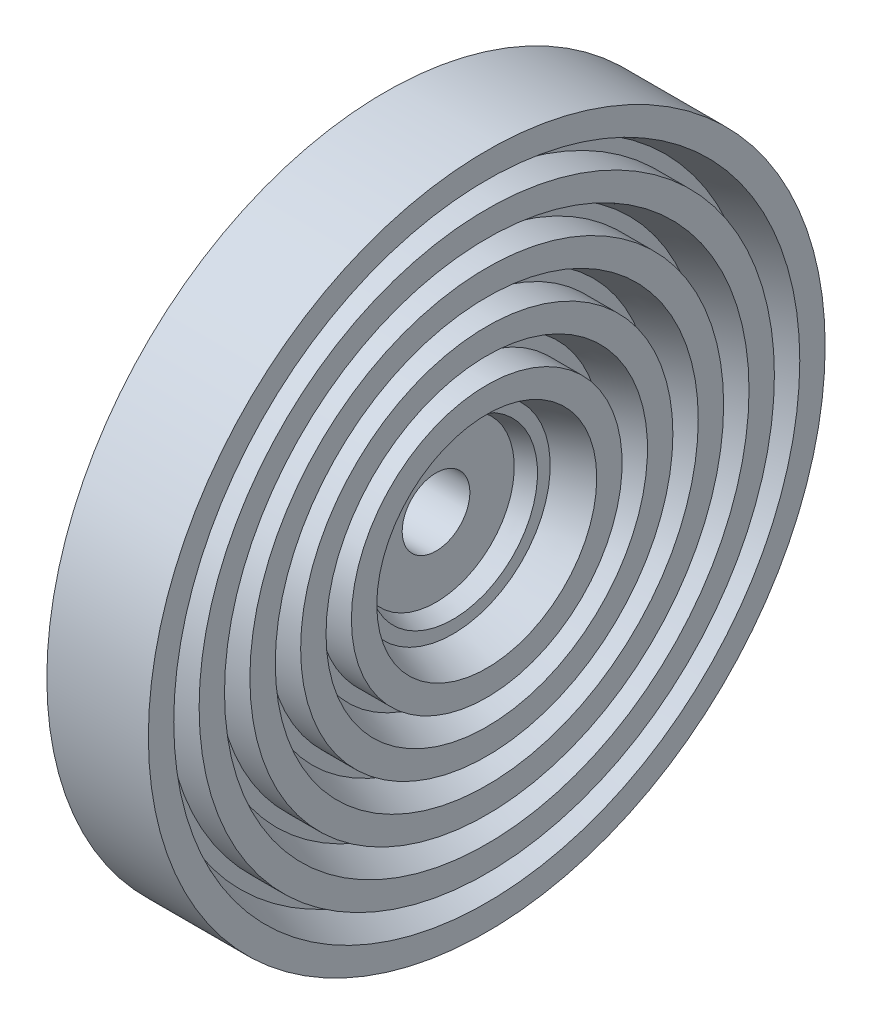
ISO-10303-21;
HEADER;
FILE_DESCRIPTION(('STEP AP214'),'2;1');
FILE_NAME('part.step','',(''),(''),'','','');
FILE_SCHEMA(('AUTOMOTIVE_DESIGN { 1 0 10303 214 1 1 1 1 }'));
ENDSEC;
DATA;
#1=APPLICATION_CONTEXT('core data for automotive mechanical design processes');
#2=APPLICATION_PROTOCOL_DEFINITION('international standard','automotive_design',2000,#1);
#3=PRODUCT_CONTEXT('',#1,'mechanical');
#4=PRODUCT('Part','Part','',(#3));
#5=PRODUCT_RELATED_PRODUCT_CATEGORY('part','',(#4));
#6=PRODUCT_DEFINITION_FORMATION('','',#4);
#7=PRODUCT_DEFINITION_CONTEXT('part definition',#1,'design');
#8=PRODUCT_DEFINITION('design','',#6,#7);
#9=PRODUCT_DEFINITION_SHAPE('','',#8);
#10=(LENGTH_UNIT() NAMED_UNIT(*) SI_UNIT(.MILLI.,.METRE.));
#11=(NAMED_UNIT(*) PLANE_ANGLE_UNIT() SI_UNIT($,.RADIAN.));
#12=(NAMED_UNIT(*) SI_UNIT($,.STERADIAN.) SOLID_ANGLE_UNIT());
#13=UNCERTAINTY_MEASURE_WITH_UNIT(LENGTH_MEASURE(1.E-05),#10,'distance_accuracy_value','');
#14=(GEOMETRIC_REPRESENTATION_CONTEXT(3) GLOBAL_UNCERTAINTY_ASSIGNED_CONTEXT((#13)) GLOBAL_UNIT_ASSIGNED_CONTEXT((#10,
#11,#12)) REPRESENTATION_CONTEXT('',''));
#15=CARTESIAN_POINT('',(0.,0.,0.));
#16=DIRECTION('',(0.,0.,1.));
#17=DIRECTION('',(1.,0.,0.));
#18=AXIS2_PLACEMENT_3D('',#15,#16,#17);
#19=CARTESIAN_POINT('',(-0.664443358360245,-2.,0.));
#20=DIRECTION('',(-1.,0.,0.));
#21=DIRECTION('',(0.,0.,1.));
#22=AXIS2_PLACEMENT_3D('',#19,#20,#21);
#23=CYLINDRICAL_SURFACE('',#22,2.);
#24=CARTESIAN_POINT('',(3.,-2.,0.));
#25=DIRECTION('',(-1.,0.,0.));
#26=DIRECTION('',(0.,0.,1.));
#27=AXIS2_PLACEMENT_3D('',#24,#25,#26);
#28=CIRCLE('',#27,2.);
#29=CARTESIAN_POINT('',(3.,-2.,2.));
#30=VERTEX_POINT('',#29);
#31=EDGE_CURVE('E106',#30,#30,#28,.T.);
#32=ORIENTED_EDGE('',*,*,#31,.F.);
#33=EDGE_LOOP('',(#32));
#34=FACE_BOUND('',#33,.T.);
#35=CARTESIAN_POINT('',(0.,-2.,0.));
#36=DIRECTION('',(-1.,0.,0.));
#37=DIRECTION('',(0.,0.,1.));
#38=AXIS2_PLACEMENT_3D('',#35,#36,#37);
#39=CIRCLE('',#38,2.);
#40=CARTESIAN_POINT('',(0.,-2.,2.));
#41=VERTEX_POINT('',#40);
#42=EDGE_CURVE('E10',#41,#41,#39,.T.);
#43=ORIENTED_EDGE('',*,*,#42,.T.);
#44=EDGE_LOOP('',(#43));
#45=FACE_BOUND('',#44,.T.);
#46=ADVANCED_FACE('F30',(#34,#45),#23,.F.);
#47=CARTESIAN_POINT('',(0.,0.,0.));
#48=DIRECTION('',(1.,0.,0.));
#49=DIRECTION('',(0.,0.,-1.));
#50=AXIS2_PLACEMENT_3D('',#47,#48,#49);
#51=PLANE('',#50);
#52=ORIENTED_EDGE('',*,*,#42,.F.);
#53=EDGE_LOOP('',(#52));
#54=FACE_BOUND('',#53,.T.);
#55=CARTESIAN_POINT('',(0.,-2.,0.));
#56=DIRECTION('',(-1.,0.,0.));
#57=DIRECTION('',(0.,0.,1.));
#58=AXIS2_PLACEMENT_3D('',#55,#56,#57);
#59=CIRCLE('',#58,20.);
#60=CARTESIAN_POINT('',(0.,-2.,20.));
#61=VERTEX_POINT('',#60);
#62=EDGE_CURVE('E36',#61,#61,#59,.T.);
#63=ORIENTED_EDGE('',*,*,#62,.T.);
#64=EDGE_LOOP('',(#63));
#65=FACE_BOUND('',#64,.T.);
#66=ADVANCED_FACE('F113',(#54,#65),#51,.F.);
#67=CARTESIAN_POINT('',(-0.664443358360245,-2.,0.));
#68=DIRECTION('',(-1.,0.,0.));
#69=DIRECTION('',(0.,0.,1.));
#70=AXIS2_PLACEMENT_3D('',#67,#68,#69);
#71=CYLINDRICAL_SURFACE('',#70,20.);
#72=ORIENTED_EDGE('',*,*,#62,.F.);
#73=EDGE_LOOP('',(#72));
#74=FACE_BOUND('',#73,.T.);
#75=CARTESIAN_POINT('',(6.,-2.,0.));
#76=DIRECTION('',(-1.,0.,0.));
#77=DIRECTION('',(0.,0.,1.));
#78=AXIS2_PLACEMENT_3D('',#75,#76,#77);
#79=CIRCLE('',#78,20.);
#80=CARTESIAN_POINT('',(6.,-2.,20.));
#81=VERTEX_POINT('',#80);
#82=EDGE_CURVE('E40',#81,#81,#79,.T.);
#83=ORIENTED_EDGE('',*,*,#82,.T.);
#84=EDGE_LOOP('',(#83));
#85=FACE_BOUND('',#84,.T.);
#86=ADVANCED_FACE('F117',(#74,#85),#71,.T.);
#87=CARTESIAN_POINT('',(6.,16.5,0.));
#88=DIRECTION('',(-1.,0.,0.));
#89=DIRECTION('',(0.,0.,1.));
#90=AXIS2_PLACEMENT_3D('',#87,#88,#89);
#91=PLANE('',#90);
#92=ORIENTED_EDGE('',*,*,#82,.F.);
#93=EDGE_LOOP('',(#92));
#94=FACE_BOUND('',#93,.T.);
#95=CARTESIAN_POINT('',(6.,-2.,0.));
#96=DIRECTION('',(-1.,0.,0.));
#97=DIRECTION('',(0.,0.,1.));
#98=AXIS2_PLACEMENT_3D('',#95,#96,#97);
#99=CIRCLE('',#98,18.5);
#100=CARTESIAN_POINT('',(6.,-2.,18.5));
#101=VERTEX_POINT('',#100);
#102=EDGE_CURVE('E44',#101,#101,#99,.T.);
#103=ORIENTED_EDGE('',*,*,#102,.T.);
#104=EDGE_LOOP('',(#103));
#105=FACE_BOUND('',#104,.T.);
#106=ADVANCED_FACE('F122',(#94,#105),#91,.F.);
#107=CARTESIAN_POINT('',(4.,-2.,0.));
#108=DIRECTION('',(1.,0.,0.));
#109=DIRECTION('',(0.,0.,-1.));
#110=AXIS2_PLACEMENT_3D('',#107,#108,#109);
#111=CONICAL_SURFACE('',#110,17.75,0.358770670270573);
#112=ORIENTED_EDGE('',*,*,#102,.F.);
#113=EDGE_LOOP('',(#112));
#114=FACE_BOUND('',#113,.T.);
#115=CARTESIAN_POINT('',(4.,-2.,0.));
#116=DIRECTION('',(-1.,0.,0.));
#117=DIRECTION('',(0.,0.,1.));
#118=AXIS2_PLACEMENT_3D('',#115,#116,#117);
#119=CIRCLE('',#118,17.75);
#120=CARTESIAN_POINT('',(4.,-2.,17.75));
#121=VERTEX_POINT('',#120);
#122=EDGE_CURVE('E49',#121,#121,#119,.T.);
#123=ORIENTED_EDGE('',*,*,#122,.T.);
#124=EDGE_LOOP('',(#123));
#125=FACE_BOUND('',#124,.T.);
#126=ADVANCED_FACE('F128',(#114,#125),#111,.F.);
#127=CARTESIAN_POINT('',(4.,15.,0.));
#128=DIRECTION('',(-1.,0.,0.));
#129=DIRECTION('',(0.,0.,1.));
#130=AXIS2_PLACEMENT_3D('',#127,#128,#129);
#131=PLANE('',#130);
#132=ORIENTED_EDGE('',*,*,#122,.F.);
#133=EDGE_LOOP('',(#132));
#134=FACE_BOUND('',#133,.T.);
#135=CARTESIAN_POINT('',(4.,-2.,0.));
#136=DIRECTION('',(-1.,0.,0.));
#137=DIRECTION('',(0.,0.,1.));
#138=AXIS2_PLACEMENT_3D('',#135,#136,#137);
#139=CIRCLE('',#138,17.);
#140=CARTESIAN_POINT('',(4.,-2.,17.));
#141=VERTEX_POINT('',#140);
#142=EDGE_CURVE('E52',#141,#141,#139,.T.);
#143=ORIENTED_EDGE('',*,*,#142,.T.);
#144=EDGE_LOOP('',(#143));
#145=FACE_BOUND('',#144,.T.);
#146=ADVANCED_FACE('F132',(#134,#145),#131,.F.);
#147=CARTESIAN_POINT('',(-0.664443358360245,-2.,0.));
#148=DIRECTION('',(-1.,0.,0.));
#149=DIRECTION('',(0.,0.,1.));
#150=AXIS2_PLACEMENT_3D('',#147,#148,#149);
#151=CYLINDRICAL_SURFACE('',#150,17.);
#152=ORIENTED_EDGE('',*,*,#142,.F.);
#153=EDGE_LOOP('',(#152));
#154=FACE_BOUND('',#153,.T.);
#155=CARTESIAN_POINT('',(6.,-2.,0.));
#156=DIRECTION('',(-1.,0.,0.));
#157=DIRECTION('',(0.,0.,1.));
#158=AXIS2_PLACEMENT_3D('',#155,#156,#157);
#159=CIRCLE('',#158,17.);
#160=CARTESIAN_POINT('',(6.,-2.,17.));
#161=VERTEX_POINT('',#160);
#162=EDGE_CURVE('E55',#161,#161,#159,.T.);
#163=ORIENTED_EDGE('',*,*,#162,.T.);
#164=EDGE_LOOP('',(#163));
#165=FACE_BOUND('',#164,.T.);
#166=ADVANCED_FACE('F136',(#154,#165),#151,.T.);
#167=CARTESIAN_POINT('',(6.,15.,0.));
#168=DIRECTION('',(-1.,0.,0.));
#169=DIRECTION('',(0.,0.,1.));
#170=AXIS2_PLACEMENT_3D('',#167,#168,#169);
#171=PLANE('',#170);
#172=ORIENTED_EDGE('',*,*,#162,.F.);
#173=EDGE_LOOP('',(#172));
#174=FACE_BOUND('',#173,.T.);
#175=CARTESIAN_POINT('',(6.,-2.,0.));
#176=DIRECTION('',(-1.,0.,0.));
#177=DIRECTION('',(0.,0.,1.));
#178=AXIS2_PLACEMENT_3D('',#175,#176,#177);
#179=CIRCLE('',#178,15.5);
#180=CARTESIAN_POINT('',(6.,-2.,15.5));
#181=VERTEX_POINT('',#180);
#182=EDGE_CURVE('E58',#181,#181,#179,.T.);
#183=ORIENTED_EDGE('',*,*,#182,.T.);
#184=EDGE_LOOP('',(#183));
#185=FACE_BOUND('',#184,.T.);
#186=ADVANCED_FACE('F140',(#174,#185),#171,.F.);
#187=CARTESIAN_POINT('',(4.,-2.,0.));
#188=DIRECTION('',(1.,0.,0.));
#189=DIRECTION('',(0.,0.,-1.));
#190=AXIS2_PLACEMENT_3D('',#187,#188,#189);
#191=CONICAL_SURFACE('',#190,14.75,0.358770670270573);
#192=ORIENTED_EDGE('',*,*,#182,.F.);
#193=EDGE_LOOP('',(#192));
#194=FACE_BOUND('',#193,.T.);
#195=CARTESIAN_POINT('',(4.,-2.,0.));
#196=DIRECTION('',(-1.,0.,0.));
#197=DIRECTION('',(0.,0.,1.));
#198=AXIS2_PLACEMENT_3D('',#195,#196,#197);
#199=CIRCLE('',#198,14.75);
#200=CARTESIAN_POINT('',(4.,-2.,14.75));
#201=VERTEX_POINT('',#200);
#202=EDGE_CURVE('E61',#201,#201,#199,.T.);
#203=ORIENTED_EDGE('',*,*,#202,.T.);
#204=EDGE_LOOP('',(#203));
#205=FACE_BOUND('',#204,.T.);
#206=ADVANCED_FACE('F144',(#194,#205),#191,.F.);
#207=CARTESIAN_POINT('',(4.,12.,0.));
#208=DIRECTION('',(-1.,0.,0.));
#209=DIRECTION('',(0.,0.,1.));
#210=AXIS2_PLACEMENT_3D('',#207,#208,#209);
#211=PLANE('',#210);
#212=ORIENTED_EDGE('',*,*,#202,.F.);
#213=EDGE_LOOP('',(#212));
#214=FACE_BOUND('',#213,.T.);
#215=CARTESIAN_POINT('',(4.,-2.,0.));
#216=DIRECTION('',(-1.,0.,0.));
#217=DIRECTION('',(0.,0.,1.));
#218=AXIS2_PLACEMENT_3D('',#215,#216,#217);
#219=CIRCLE('',#218,14.);
#220=CARTESIAN_POINT('',(4.,-2.,14.));
#221=VERTEX_POINT('',#220);
#222=EDGE_CURVE('E64',#221,#221,#219,.T.);
#223=ORIENTED_EDGE('',*,*,#222,.T.);
#224=EDGE_LOOP('',(#223));
#225=FACE_BOUND('',#224,.T.);
#226=ADVANCED_FACE('F148',(#214,#225),#211,.F.);
#227=CARTESIAN_POINT('',(-0.664443358360245,-2.,0.));
#228=DIRECTION('',(-1.,0.,0.));
#229=DIRECTION('',(0.,0.,1.));
#230=AXIS2_PLACEMENT_3D('',#227,#228,#229);
#231=CYLINDRICAL_SURFACE('',#230,14.);
#232=ORIENTED_EDGE('',*,*,#222,.F.);
#233=EDGE_LOOP('',(#232));
#234=FACE_BOUND('',#233,.T.);
#235=CARTESIAN_POINT('',(6.,-2.,0.));
#236=DIRECTION('',(-1.,0.,0.));
#237=DIRECTION('',(0.,0.,1.));
#238=AXIS2_PLACEMENT_3D('',#235,#236,#237);
#239=CIRCLE('',#238,14.);
#240=CARTESIAN_POINT('',(6.,-2.,14.));
#241=VERTEX_POINT('',#240);
#242=EDGE_CURVE('E67',#241,#241,#239,.T.);
#243=ORIENTED_EDGE('',*,*,#242,.T.);
#244=EDGE_LOOP('',(#243));
#245=FACE_BOUND('',#244,.T.);
#246=ADVANCED_FACE('F152',(#234,#245),#231,.T.);
#247=CARTESIAN_POINT('',(6.,10.5,0.));
#248=DIRECTION('',(-1.,0.,0.));
#249=DIRECTION('',(0.,0.,1.));
#250=AXIS2_PLACEMENT_3D('',#247,#248,#249);
#251=PLANE('',#250);
#252=ORIENTED_EDGE('',*,*,#242,.F.);
#253=EDGE_LOOP('',(#252));
#254=FACE_BOUND('',#253,.T.);
#255=CARTESIAN_POINT('',(6.,-2.,0.));
#256=DIRECTION('',(-1.,0.,0.));
#257=DIRECTION('',(0.,0.,1.));
#258=AXIS2_PLACEMENT_3D('',#255,#256,#257);
#259=CIRCLE('',#258,12.5);
#260=CARTESIAN_POINT('',(6.,-2.,12.5));
#261=VERTEX_POINT('',#260);
#262=EDGE_CURVE('E70',#261,#261,#259,.T.);
#263=ORIENTED_EDGE('',*,*,#262,.T.);
#264=EDGE_LOOP('',(#263));
#265=FACE_BOUND('',#264,.T.);
#266=ADVANCED_FACE('F156',(#254,#265),#251,.F.);
#267=CARTESIAN_POINT('',(4.,-2.,0.));
#268=DIRECTION('',(1.,0.,0.));
#269=DIRECTION('',(0.,0.,-1.));
#270=AXIS2_PLACEMENT_3D('',#267,#268,#269);
#271=CONICAL_SURFACE('',#270,11.75,0.358770670270571);
#272=ORIENTED_EDGE('',*,*,#262,.F.);
#273=EDGE_LOOP('',(#272));
#274=FACE_BOUND('',#273,.T.);
#275=CARTESIAN_POINT('',(4.,-2.,0.));
#276=DIRECTION('',(-1.,0.,0.));
#277=DIRECTION('',(0.,0.,1.));
#278=AXIS2_PLACEMENT_3D('',#275,#276,#277);
#279=CIRCLE('',#278,11.75);
#280=CARTESIAN_POINT('',(4.,-2.,11.75));
#281=VERTEX_POINT('',#280);
#282=EDGE_CURVE('E73',#281,#281,#279,.T.);
#283=ORIENTED_EDGE('',*,*,#282,.T.);
#284=EDGE_LOOP('',(#283));
#285=FACE_BOUND('',#284,.T.);
#286=ADVANCED_FACE('F160',(#274,#285),#271,.F.);
#287=CARTESIAN_POINT('',(4.,9.,0.));
#288=DIRECTION('',(-1.,0.,0.));
#289=DIRECTION('',(0.,0.,1.));
#290=AXIS2_PLACEMENT_3D('',#287,#288,#289);
#291=PLANE('',#290);
#292=ORIENTED_EDGE('',*,*,#282,.F.);
#293=EDGE_LOOP('',(#292));
#294=FACE_BOUND('',#293,.T.);
#295=CARTESIAN_POINT('',(4.,-2.,0.));
#296=DIRECTION('',(-1.,0.,0.));
#297=DIRECTION('',(0.,0.,1.));
#298=AXIS2_PLACEMENT_3D('',#295,#296,#297);
#299=CIRCLE('',#298,11.);
#300=CARTESIAN_POINT('',(4.,-2.,11.));
#301=VERTEX_POINT('',#300);
#302=EDGE_CURVE('E76',#301,#301,#299,.T.);
#303=ORIENTED_EDGE('',*,*,#302,.T.);
#304=EDGE_LOOP('',(#303));
#305=FACE_BOUND('',#304,.T.);
#306=ADVANCED_FACE('F164',(#294,#305),#291,.F.);
#307=CARTESIAN_POINT('',(-0.664443358360245,-2.,0.));
#308=DIRECTION('',(-1.,0.,0.));
#309=DIRECTION('',(0.,0.,1.));
#310=AXIS2_PLACEMENT_3D('',#307,#308,#309);
#311=CYLINDRICAL_SURFACE('',#310,11.);
#312=ORIENTED_EDGE('',*,*,#302,.F.);
#313=EDGE_LOOP('',(#312));
#314=FACE_BOUND('',#313,.T.);
#315=CARTESIAN_POINT('',(5.99999999999999,-2.,0.));
#316=DIRECTION('',(-1.,0.,0.));
#317=DIRECTION('',(0.,0.,1.));
#318=AXIS2_PLACEMENT_3D('',#315,#316,#317);
#319=CIRCLE('',#318,11.);
#320=CARTESIAN_POINT('',(5.99999999999999,-2.,11.));
#321=VERTEX_POINT('',#320);
#322=EDGE_CURVE('E79',#321,#321,#319,.T.);
#323=ORIENTED_EDGE('',*,*,#322,.T.);
#324=EDGE_LOOP('',(#323));
#325=FACE_BOUND('',#324,.T.);
#326=ADVANCED_FACE('F168',(#314,#325),#311,.T.);
#327=CARTESIAN_POINT('',(5.99999999999999,9.,0.));
#328=DIRECTION('',(-1.,0.,0.));
#329=DIRECTION('',(0.,0.,1.));
#330=AXIS2_PLACEMENT_3D('',#327,#328,#329);
#331=PLANE('',#330);
#332=ORIENTED_EDGE('',*,*,#322,.F.);
#333=EDGE_LOOP('',(#332));
#334=FACE_BOUND('',#333,.T.);
#335=CARTESIAN_POINT('',(5.99999999999999,-2.,0.));
#336=DIRECTION('',(-1.,0.,0.));
#337=DIRECTION('',(0.,0.,1.));
#338=AXIS2_PLACEMENT_3D('',#335,#336,#337);
#339=CIRCLE('',#338,9.5);
#340=CARTESIAN_POINT('',(5.99999999999999,-2.,9.5));
#341=VERTEX_POINT('',#340);
#342=EDGE_CURVE('E82',#341,#341,#339,.T.);
#343=ORIENTED_EDGE('',*,*,#342,.T.);
#344=EDGE_LOOP('',(#343));
#345=FACE_BOUND('',#344,.T.);
#346=ADVANCED_FACE('F172',(#334,#345),#331,.F.);
#347=CARTESIAN_POINT('',(4.,-2.,0.));
#348=DIRECTION('',(1.,0.,0.));
#349=DIRECTION('',(0.,0.,-1.));
#350=AXIS2_PLACEMENT_3D('',#347,#348,#349);
#351=CONICAL_SURFACE('',#350,8.75,0.358770670270573);
#352=ORIENTED_EDGE('',*,*,#342,.F.);
#353=EDGE_LOOP('',(#352));
#354=FACE_BOUND('',#353,.T.);
#355=CARTESIAN_POINT('',(4.,-2.,0.));
#356=DIRECTION('',(-1.,0.,0.));
#357=DIRECTION('',(0.,0.,1.));
#358=AXIS2_PLACEMENT_3D('',#355,#356,#357);
#359=CIRCLE('',#358,8.75);
#360=CARTESIAN_POINT('',(4.,-2.,8.75));
#361=VERTEX_POINT('',#360);
#362=EDGE_CURVE('E85',#361,#361,#359,.T.);
#363=ORIENTED_EDGE('',*,*,#362,.T.);
#364=EDGE_LOOP('',(#363));
#365=FACE_BOUND('',#364,.T.);
#366=ADVANCED_FACE('F176',(#354,#365),#351,.F.);
#367=CARTESIAN_POINT('',(4.,6.75,0.));
#368=DIRECTION('',(-1.,0.,0.));
#369=DIRECTION('',(0.,0.,1.));
#370=AXIS2_PLACEMENT_3D('',#367,#368,#369);
#371=PLANE('',#370);
#372=ORIENTED_EDGE('',*,*,#362,.F.);
#373=EDGE_LOOP('',(#372));
#374=FACE_BOUND('',#373,.T.);
#375=CARTESIAN_POINT('',(4.,-2.,0.));
#376=DIRECTION('',(-1.,0.,0.));
#377=DIRECTION('',(0.,0.,1.));
#378=AXIS2_PLACEMENT_3D('',#375,#376,#377);
#379=CIRCLE('',#378,8.);
#380=CARTESIAN_POINT('',(4.,-2.,8.));
#381=VERTEX_POINT('',#380);
#382=EDGE_CURVE('E88',#381,#381,#379,.T.);
#383=ORIENTED_EDGE('',*,*,#382,.T.);
#384=EDGE_LOOP('',(#383));
#385=FACE_BOUND('',#384,.T.);
#386=ADVANCED_FACE('F180',(#374,#385),#371,.F.);
#387=CARTESIAN_POINT('',(-0.664443358360245,-2.,0.));
#388=DIRECTION('',(-1.,0.,0.));
#389=DIRECTION('',(0.,0.,1.));
#390=AXIS2_PLACEMENT_3D('',#387,#388,#389);
#391=CYLINDRICAL_SURFACE('',#390,8.);
#392=ORIENTED_EDGE('',*,*,#382,.F.);
#393=EDGE_LOOP('',(#392));
#394=FACE_BOUND('',#393,.T.);
#395=CARTESIAN_POINT('',(5.99999999999999,-2.,0.));
#396=DIRECTION('',(-1.,0.,0.));
#397=DIRECTION('',(0.,0.,1.));
#398=AXIS2_PLACEMENT_3D('',#395,#396,#397);
#399=CIRCLE('',#398,8.);
#400=CARTESIAN_POINT('',(5.99999999999999,-2.,8.));
#401=VERTEX_POINT('',#400);
#402=EDGE_CURVE('E91',#401,#401,#399,.T.);
#403=ORIENTED_EDGE('',*,*,#402,.T.);
#404=EDGE_LOOP('',(#403));
#405=FACE_BOUND('',#404,.T.);
#406=ADVANCED_FACE('F184',(#394,#405),#391,.T.);
#407=CARTESIAN_POINT('',(5.99999999999999,6.,0.));
#408=DIRECTION('',(-1.,0.,0.));
#409=DIRECTION('',(0.,0.,1.));
#410=AXIS2_PLACEMENT_3D('',#407,#408,#409);
#411=PLANE('',#410);
#412=ORIENTED_EDGE('',*,*,#402,.F.);
#413=EDGE_LOOP('',(#412));
#414=FACE_BOUND('',#413,.T.);
#415=CARTESIAN_POINT('',(5.99999999999999,-2.,0.));
#416=DIRECTION('',(-1.,0.,0.));
#417=DIRECTION('',(0.,0.,1.));
#418=AXIS2_PLACEMENT_3D('',#415,#416,#417);
#419=CIRCLE('',#418,6.5);
#420=CARTESIAN_POINT('',(5.99999999999999,-2.,6.5));
#421=VERTEX_POINT('',#420);
#422=EDGE_CURVE('E94',#421,#421,#419,.T.);
#423=ORIENTED_EDGE('',*,*,#422,.T.);
#424=EDGE_LOOP('',(#423));
#425=FACE_BOUND('',#424,.T.);
#426=ADVANCED_FACE('F188',(#414,#425),#411,.F.);
#427=CARTESIAN_POINT('',(4.,-2.,0.));
#428=DIRECTION('',(1.,0.,0.));
#429=DIRECTION('',(0.,0.,-1.));
#430=AXIS2_PLACEMENT_3D('',#427,#428,#429);
#431=CONICAL_SURFACE('',#430,5.75,0.358770670270572);
#432=ORIENTED_EDGE('',*,*,#422,.F.);
#433=EDGE_LOOP('',(#432));
#434=FACE_BOUND('',#433,.T.);
#435=CARTESIAN_POINT('',(4.,-2.,0.));
#436=DIRECTION('',(-1.,0.,0.));
#437=DIRECTION('',(0.,0.,1.));
#438=AXIS2_PLACEMENT_3D('',#435,#436,#437);
#439=CIRCLE('',#438,5.75);
#440=CARTESIAN_POINT('',(4.,-2.,5.75));
#441=VERTEX_POINT('',#440);
#442=EDGE_CURVE('E97',#441,#441,#439,.T.);
#443=ORIENTED_EDGE('',*,*,#442,.T.);
#444=EDGE_LOOP('',(#443));
#445=FACE_BOUND('',#444,.T.);
#446=ADVANCED_FACE('F192',(#434,#445),#431,.F.);
#447=CARTESIAN_POINT('',(4.,3.75,0.));
#448=DIRECTION('',(-1.,0.,0.));
#449=DIRECTION('',(0.,0.,1.));
#450=AXIS2_PLACEMENT_3D('',#447,#448,#449);
#451=PLANE('',#450);
#452=ORIENTED_EDGE('',*,*,#442,.F.);
#453=EDGE_LOOP('',(#452));
#454=FACE_BOUND('',#453,.T.);
#455=CARTESIAN_POINT('',(4.,-2.,0.));
#456=DIRECTION('',(-1.,0.,0.));
#457=DIRECTION('',(0.,0.,1.));
#458=AXIS2_PLACEMENT_3D('',#455,#456,#457);
#459=CIRCLE('',#458,5.);
#460=CARTESIAN_POINT('',(4.,-2.,5.));
#461=VERTEX_POINT('',#460);
#462=EDGE_CURVE('E100',#461,#461,#459,.T.);
#463=ORIENTED_EDGE('',*,*,#462,.T.);
#464=EDGE_LOOP('',(#463));
#465=FACE_BOUND('',#464,.T.);
#466=ADVANCED_FACE('F196',(#454,#465),#451,.F.);
#467=CARTESIAN_POINT('',(3.,-2.,0.));
#468=DIRECTION('',(1.,0.,0.));
#469=DIRECTION('',(0.,0.,-1.));
#470=AXIS2_PLACEMENT_3D('',#467,#468,#469);
#471=CONICAL_SURFACE('',#470,4.625,0.358770670270572);
#472=ORIENTED_EDGE('',*,*,#462,.F.);
#473=EDGE_LOOP('',(#472));
#474=FACE_BOUND('',#473,.T.);
#475=CARTESIAN_POINT('',(3.,-2.,0.));
#476=DIRECTION('',(-1.,0.,0.));
#477=DIRECTION('',(0.,0.,1.));
#478=AXIS2_PLACEMENT_3D('',#475,#476,#477);
#479=CIRCLE('',#478,4.625);
#480=CARTESIAN_POINT('',(3.,-2.,4.625));
#481=VERTEX_POINT('',#480);
#482=EDGE_CURVE('E103',#481,#481,#479,.T.);
#483=ORIENTED_EDGE('',*,*,#482,.T.);
#484=EDGE_LOOP('',(#483));
#485=FACE_BOUND('',#484,.T.);
#486=ADVANCED_FACE('F200',(#474,#485),#471,.F.);
#487=CARTESIAN_POINT('',(3.,2.625,0.));
#488=DIRECTION('',(-1.,0.,0.));
#489=DIRECTION('',(0.,0.,1.));
#490=AXIS2_PLACEMENT_3D('',#487,#488,#489);
#491=PLANE('',#490);
#492=ORIENTED_EDGE('',*,*,#482,.F.);
#493=EDGE_LOOP('',(#492));
#494=FACE_BOUND('',#493,.T.);
#495=ORIENTED_EDGE('',*,*,#31,.T.);
#496=EDGE_LOOP('',(#495));
#497=FACE_BOUND('',#496,.T.);
#498=ADVANCED_FACE('F110',(#494,#497),#491,.F.);
#499=CLOSED_SHELL('',(#46,#66,#86,#106,#126,#146,#166,#186,#206,#226,#246,#266,#286,#306,#326,
#346,#366,#386,#406,#426,#446,#466,#486,#498));
#500=MANIFOLD_SOLID_BREP('B2',#499);
#501=ADVANCED_BREP_SHAPE_REPRESENTATION('',(#18,#500),#14);
#502=SHAPE_DEFINITION_REPRESENTATION(#9,#501);
ENDSEC;
END-ISO-10303-21;
